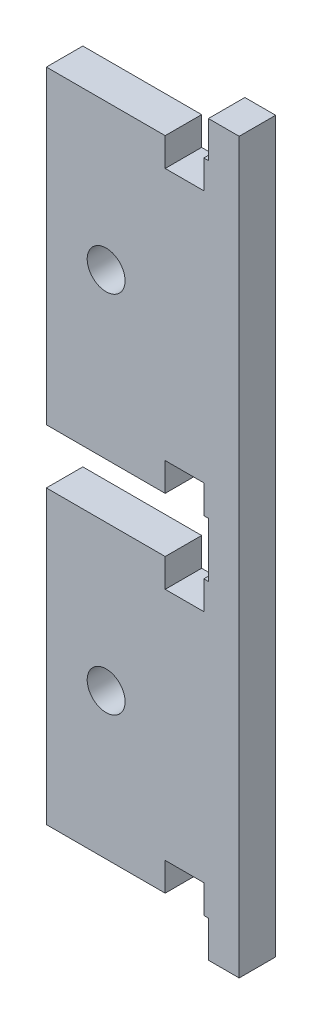
ISO-10303-21;
HEADER;
FILE_DESCRIPTION(('STEP AP214'),'2;1');
FILE_NAME('part.step','',(''),(''),'','','');
FILE_SCHEMA(('AUTOMOTIVE_DESIGN { 1 0 10303 214 1 1 1 1 }'));
ENDSEC;
DATA;
#1=APPLICATION_CONTEXT('core data for automotive mechanical design processes');
#2=APPLICATION_PROTOCOL_DEFINITION('international standard','automotive_design',2000,#1);
#3=PRODUCT_CONTEXT('',#1,'mechanical');
#4=PRODUCT('Part','Part','',(#3));
#5=PRODUCT_RELATED_PRODUCT_CATEGORY('part','',(#4));
#6=PRODUCT_DEFINITION_FORMATION('','',#4);
#7=PRODUCT_DEFINITION_CONTEXT('part definition',#1,'design');
#8=PRODUCT_DEFINITION('design','',#6,#7);
#9=PRODUCT_DEFINITION_SHAPE('','',#8);
#10=(LENGTH_UNIT() NAMED_UNIT(*) SI_UNIT(.MILLI.,.METRE.));
#11=(NAMED_UNIT(*) PLANE_ANGLE_UNIT() SI_UNIT($,.RADIAN.));
#12=(NAMED_UNIT(*) SI_UNIT($,.STERADIAN.) SOLID_ANGLE_UNIT());
#13=UNCERTAINTY_MEASURE_WITH_UNIT(LENGTH_MEASURE(1.E-05),#10,'distance_accuracy_value','');
#14=(GEOMETRIC_REPRESENTATION_CONTEXT(3) GLOBAL_UNCERTAINTY_ASSIGNED_CONTEXT((#13)) GLOBAL_UNIT_ASSIGNED_CONTEXT((#10,
#11,#12)) REPRESENTATION_CONTEXT('',''));
#15=CARTESIAN_POINT('',(0.,0.,0.));
#16=DIRECTION('',(0.,0.,1.));
#17=DIRECTION('',(1.,0.,0.));
#18=AXIS2_PLACEMENT_3D('',#15,#16,#17);
#19=CARTESIAN_POINT('',(0.,0.,6.35));
#20=DIRECTION('',(0.,0.,-1.));
#21=DIRECTION('',(-1.,0.,0.));
#22=AXIS2_PLACEMENT_3D('',#19,#20,#21);
#23=PLANE('',#22);
#24=CARTESIAN_POINT('',(17.4625000000002,95.2500000000022,6.35));
#25=DIRECTION('',(0.,0.,1.));
#26=DIRECTION('',(1.,0.,0.));
#27=AXIS2_PLACEMENT_3D('',#24,#25,#26);
#28=CIRCLE('',#27,3.29999999999999);
#29=CARTESIAN_POINT('',(20.7625000000001,95.2500000000022,6.35));
#30=VERTEX_POINT('',#29);
#31=EDGE_CURVE('E397',#30,#30,#28,.T.);
#32=ORIENTED_EDGE('',*,*,#31,.F.);
#33=EDGE_LOOP('',(#32));
#34=FACE_BOUND('',#33,.T.);
#35=CARTESIAN_POINT('',(17.4625000000025,31.7500000000057,6.35));
#36=DIRECTION('',(0.,0.,1.));
#37=DIRECTION('',(1.,0.,0.));
#38=AXIS2_PLACEMENT_3D('',#35,#36,#37);
#39=CIRCLE('',#38,3.29999999999999);
#40=CARTESIAN_POINT('',(20.7625000000025,31.7500000000057,6.35));
#41=VERTEX_POINT('',#40);
#42=EDGE_CURVE('E391',#41,#41,#39,.T.);
#43=ORIENTED_EDGE('',*,*,#42,.F.);
#44=EDGE_LOOP('',(#43));
#45=FACE_BOUND('',#44,.T.);
#46=DIRECTION('',(-1.,0.,0.));
#47=VECTOR('',#46,1.);
#48=CARTESIAN_POINT('',(0.,6.34999999999999,6.35));
#49=LINE('',#48,#47);
#50=CARTESIAN_POINT('',(27.7495000000019,6.34999999999999,6.35));
#51=VERTEX_POINT('',#50);
#52=CARTESIAN_POINT('',(7.05050000000018,6.34999999999999,6.35));
#53=VERTEX_POINT('',#52);
#54=EDGE_CURVE('E375',#51,#53,#49,.T.);
#55=ORIENTED_EDGE('',*,*,#54,.F.);
#56=DIRECTION('',(0.,-1.,0.));
#57=VECTOR('',#56,1.);
#58=CARTESIAN_POINT('',(27.7495000000019,0.,6.35));
#59=LINE('',#58,#57);
#60=CARTESIAN_POINT('',(27.7495000000019,11.303,6.35));
#61=VERTEX_POINT('',#60);
#62=EDGE_CURVE('E243',#61,#51,#59,.T.);
#63=ORIENTED_EDGE('',*,*,#62,.F.);
#64=DIRECTION('',(-1.,0.,0.));
#65=VECTOR('',#64,1.);
#66=CARTESIAN_POINT('',(0.,11.303,6.35));
#67=LINE('',#66,#65);
#68=CARTESIAN_POINT('',(34.4805000000019,11.303,6.35));
#69=VERTEX_POINT('',#68);
#70=EDGE_CURVE('E245',#69,#61,#67,.T.);
#71=ORIENTED_EDGE('',*,*,#70,.F.);
#72=DIRECTION('',(0.,-1.,0.));
#73=VECTOR('',#72,1.);
#74=CARTESIAN_POINT('',(34.4805000000019,0.,6.35));
#75=LINE('',#74,#73);
#76=CARTESIAN_POINT('',(34.4805000000019,6.34999999999999,6.35));
#77=VERTEX_POINT('',#76);
#78=EDGE_CURVE('E223',#69,#77,#75,.T.);
#79=ORIENTED_EDGE('',*,*,#78,.T.);
#80=CARTESIAN_POINT('',(35.2818700000001,6.34999999999999,6.35));
#81=VERTEX_POINT('',#80);
#82=EDGE_CURVE('E370',#81,#77,#49,.T.);
#83=ORIENTED_EDGE('',*,*,#82,.F.);
#84=DIRECTION('',(0.,-1.,0.));
#85=VECTOR('',#84,1.);
#86=CARTESIAN_POINT('',(35.2818700000002,0.,6.35));
#87=LINE('',#86,#85);
#88=CARTESIAN_POINT('',(35.2818700000002,0.,6.35));
#89=VERTEX_POINT('',#88);
#90=EDGE_CURVE('E252',#81,#89,#87,.T.);
#91=ORIENTED_EDGE('',*,*,#90,.T.);
#92=DIRECTION('',(1.,0.,0.));
#93=VECTOR('',#92,1.);
#94=CARTESIAN_POINT('',(0.,0.,6.35));
#95=LINE('',#94,#93);
#96=CARTESIAN_POINT('',(40.64,0.,6.35));
#97=VERTEX_POINT('',#96);
#98=EDGE_CURVE('E404',#89,#97,#95,.T.);
#99=ORIENTED_EDGE('',*,*,#98,.T.);
#100=DIRECTION('',(0.,1.,0.));
#101=VECTOR('',#100,1.);
#102=CARTESIAN_POINT('',(40.64,0.,6.35));
#103=LINE('',#102,#101);
#104=CARTESIAN_POINT('',(40.64,127.,6.35));
#105=VERTEX_POINT('',#104);
#106=EDGE_CURVE('E406',#97,#105,#103,.T.);
#107=ORIENTED_EDGE('',*,*,#106,.T.);
#108=DIRECTION('',(-1.,0.,0.));
#109=VECTOR('',#108,1.);
#110=CARTESIAN_POINT('',(0.,127.,6.35));
#111=LINE('',#110,#109);
#112=CARTESIAN_POINT('',(35.2818700000001,127.,6.35));
#113=VERTEX_POINT('',#112);
#114=EDGE_CURVE('E409',#105,#113,#111,.T.);
#115=ORIENTED_EDGE('',*,*,#114,.T.);
#116=DIRECTION('',(0.,-1.,0.));
#117=VECTOR('',#116,1.);
#118=CARTESIAN_POINT('',(35.2818700000002,0.,6.35));
#119=LINE('',#118,#117);
#120=CARTESIAN_POINT('',(35.2818700000001,120.65,6.35));
#121=VERTEX_POINT('',#120);
#122=EDGE_CURVE('E323',#113,#121,#119,.T.);
#123=ORIENTED_EDGE('',*,*,#122,.T.);
#124=DIRECTION('',(1.,0.,0.));
#125=VECTOR('',#124,1.);
#126=CARTESIAN_POINT('',(0.,120.65,6.35));
#127=LINE('',#126,#125);
#128=CARTESIAN_POINT('',(34.4805000000019,120.65,6.35));
#129=VERTEX_POINT('',#128);
#130=EDGE_CURVE('E324',#129,#121,#127,.T.);
#131=ORIENTED_EDGE('',*,*,#130,.F.);
#132=DIRECTION('',(0.,-1.,0.));
#133=VECTOR('',#132,1.);
#134=CARTESIAN_POINT('',(34.4805000000019,0.,6.35));
#135=LINE('',#134,#133);
#136=CARTESIAN_POINT('',(34.4805000000019,115.697000000002,6.35));
#137=VERTEX_POINT('',#136);
#138=EDGE_CURVE('E297',#129,#137,#135,.T.);
#139=ORIENTED_EDGE('',*,*,#138,.T.);
#140=DIRECTION('',(-1.,0.,0.));
#141=VECTOR('',#140,1.);
#142=CARTESIAN_POINT('',(0.,115.697000000002,6.35));
#143=LINE('',#142,#141);
#144=CARTESIAN_POINT('',(27.7495000000019,115.697000000002,6.35));
#145=VERTEX_POINT('',#144);
#146=EDGE_CURVE('E304',#137,#145,#143,.T.);
#147=ORIENTED_EDGE('',*,*,#146,.T.);
#148=DIRECTION('',(0.,-1.,0.));
#149=VECTOR('',#148,1.);
#150=CARTESIAN_POINT('',(27.7495000000019,0.,6.35));
#151=LINE('',#150,#149);
#152=CARTESIAN_POINT('',(27.7495000000019,120.65,6.35));
#153=VERTEX_POINT('',#152);
#154=EDGE_CURVE('E302',#153,#145,#151,.T.);
#155=ORIENTED_EDGE('',*,*,#154,.F.);
#156=CARTESIAN_POINT('',(7.05050000000017,120.65,6.35));
#157=VERTEX_POINT('',#156);
#158=EDGE_CURVE('E320',#157,#153,#127,.T.);
#159=ORIENTED_EDGE('',*,*,#158,.F.);
#160=DIRECTION('',(0.,1.,0.));
#161=VECTOR('',#160,1.);
#162=CARTESIAN_POINT('',(7.05050000000018,0.,6.35));
#163=LINE('',#162,#161);
#164=CARTESIAN_POINT('',(7.05050000000017,66.6750000000037,6.35));
#165=VERTEX_POINT('',#164);
#166=EDGE_CURVE('E387',#165,#157,#163,.T.);
#167=ORIENTED_EDGE('',*,*,#166,.F.);
#168=DIRECTION('',(-1.,0.,0.));
#169=VECTOR('',#168,1.);
#170=CARTESIAN_POINT('',(0.,66.6750000000037,6.35));
#171=LINE('',#170,#169);
#172=CARTESIAN_POINT('',(27.7495000000019,66.6750000000037,6.35));
#173=VERTEX_POINT('',#172);
#174=EDGE_CURVE('E354',#173,#165,#171,.T.);
#175=ORIENTED_EDGE('',*,*,#174,.F.);
#176=DIRECTION('',(0.,-1.,0.));
#177=VECTOR('',#176,1.);
#178=CARTESIAN_POINT('',(27.7495000000019,0.,6.35));
#179=LINE('',#178,#177);
#180=CARTESIAN_POINT('',(27.7495000000019,71.6280000000059,6.35));
#181=VERTEX_POINT('',#180);
#182=EDGE_CURVE('E59',#181,#173,#179,.T.);
#183=ORIENTED_EDGE('',*,*,#182,.F.);
#184=DIRECTION('',(-1.,0.,0.));
#185=VECTOR('',#184,1.);
#186=CARTESIAN_POINT('',(0.,71.6280000000059,6.35));
#187=LINE('',#186,#185);
#188=CARTESIAN_POINT('',(34.4805000000019,71.6280000000059,6.35));
#189=VERTEX_POINT('',#188);
#190=EDGE_CURVE('E286',#189,#181,#187,.T.);
#191=ORIENTED_EDGE('',*,*,#190,.F.);
#192=DIRECTION('',(0.,-1.,0.));
#193=VECTOR('',#192,1.);
#194=CARTESIAN_POINT('',(34.4805000000019,0.,6.35));
#195=LINE('',#194,#193);
#196=CARTESIAN_POINT('',(34.4805000000019,66.6750000000037,6.35));
#197=VERTEX_POINT('',#196);
#198=EDGE_CURVE('E283',#189,#197,#195,.T.);
#199=ORIENTED_EDGE('',*,*,#198,.T.);
#200=CARTESIAN_POINT('',(35.2818700000001,66.6750000000037,6.35));
#201=VERTEX_POINT('',#200);
#202=EDGE_CURVE('E355',#201,#197,#171,.T.);
#203=ORIENTED_EDGE('',*,*,#202,.F.);
#204=DIRECTION('',(0.,-1.,0.));
#205=VECTOR('',#204,1.);
#206=CARTESIAN_POINT('',(35.2818700000002,0.,6.35));
#207=LINE('',#206,#205);
#208=CARTESIAN_POINT('',(35.2818700000001,57.1500000000035,6.35));
#209=VERTEX_POINT('',#208);
#210=EDGE_CURVE('E350',#201,#209,#207,.T.);
#211=ORIENTED_EDGE('',*,*,#210,.T.);
#212=DIRECTION('',(1.,0.,0.));
#213=VECTOR('',#212,1.);
#214=CARTESIAN_POINT('',(0.,57.1500000000035,6.35));
#215=LINE('',#214,#213);
#216=CARTESIAN_POINT('',(34.4805000000019,57.1500000000035,6.35));
#217=VERTEX_POINT('',#216);
#218=EDGE_CURVE('E351',#217,#209,#215,.T.);
#219=ORIENTED_EDGE('',*,*,#218,.F.);
#220=DIRECTION('',(0.,-1.,0.));
#221=VECTOR('',#220,1.);
#222=CARTESIAN_POINT('',(34.4805000000019,0.,6.35));
#223=LINE('',#222,#221);
#224=CARTESIAN_POINT('',(34.4805000000019,52.1970000000057,6.35));
#225=VERTEX_POINT('',#224);
#226=EDGE_CURVE('E258',#217,#225,#223,.T.);
#227=ORIENTED_EDGE('',*,*,#226,.T.);
#228=DIRECTION('',(-1.,0.,0.));
#229=VECTOR('',#228,1.);
#230=CARTESIAN_POINT('',(0.,52.1970000000057,6.35));
#231=LINE('',#230,#229);
#232=CARTESIAN_POINT('',(27.7495000000019,52.1970000000057,6.35));
#233=VERTEX_POINT('',#232);
#234=EDGE_CURVE('E265',#225,#233,#231,.T.);
#235=ORIENTED_EDGE('',*,*,#234,.T.);
#236=DIRECTION('',(0.,-1.,0.));
#237=VECTOR('',#236,1.);
#238=CARTESIAN_POINT('',(27.7495000000019,0.,6.35));
#239=LINE('',#238,#237);
#240=CARTESIAN_POINT('',(27.7495000000019,57.1500000000035,6.35));
#241=VERTEX_POINT('',#240);
#242=EDGE_CURVE('E263',#241,#233,#239,.T.);
#243=ORIENTED_EDGE('',*,*,#242,.F.);
#244=CARTESIAN_POINT('',(7.05050000000018,57.1500000000035,6.35));
#245=VERTEX_POINT('',#244);
#246=EDGE_CURVE('E347',#245,#241,#215,.T.);
#247=ORIENTED_EDGE('',*,*,#246,.F.);
#248=EDGE_CURVE('E390',#53,#245,#163,.T.);
#249=ORIENTED_EDGE('',*,*,#248,.F.);
#250=EDGE_LOOP('',(#55,#63,#71,#79,#83,#91,#99,#107,#115,#123,#131,#139,#147,#155,#159,#167,
#175,#183,#191,#199,#203,#211,#219,#227,#235,#243,#247,#249));
#251=FACE_BOUND('',#250,.T.);
#252=ADVANCED_FACE('F36',(#34,#45,#251),#23,.F.);
#253=CARTESIAN_POINT('',(0.,0.,0.));
#254=DIRECTION('',(0.,0.,-1.));
#255=DIRECTION('',(-1.,0.,0.));
#256=AXIS2_PLACEMENT_3D('',#253,#254,#255);
#257=PLANE('',#256);
#258=DIRECTION('',(0.,-1.,0.));
#259=VECTOR('',#258,1.);
#260=CARTESIAN_POINT('',(27.7495000000019,0.,0.));
#261=LINE('',#260,#259);
#262=CARTESIAN_POINT('',(27.7495000000019,11.303,0.));
#263=VERTEX_POINT('',#262);
#264=CARTESIAN_POINT('',(27.7495000000019,6.34999999999999,0.));
#265=VERTEX_POINT('',#264);
#266=EDGE_CURVE('E228',#263,#265,#261,.T.);
#267=ORIENTED_EDGE('',*,*,#266,.T.);
#268=DIRECTION('',(-1.,0.,0.));
#269=VECTOR('',#268,1.);
#270=CARTESIAN_POINT('',(0.,6.34999999999999,0.));
#271=LINE('',#270,#269);
#272=CARTESIAN_POINT('',(7.05050000000018,6.34999999999999,0.));
#273=VERTEX_POINT('',#272);
#274=EDGE_CURVE('E369',#265,#273,#271,.T.);
#275=ORIENTED_EDGE('',*,*,#274,.T.);
#276=DIRECTION('',(0.,-1.,0.));
#277=VECTOR('',#276,1.);
#278=CARTESIAN_POINT('',(7.05050000000018,0.,0.));
#279=LINE('',#278,#277);
#280=CARTESIAN_POINT('',(7.05050000000018,57.1500000000035,0.));
#281=VERTEX_POINT('',#280);
#282=EDGE_CURVE('E330',#281,#273,#279,.T.);
#283=ORIENTED_EDGE('',*,*,#282,.F.);
#284=DIRECTION('',(1.,0.,0.));
#285=VECTOR('',#284,1.);
#286=CARTESIAN_POINT('',(0.,57.1500000000035,0.));
#287=LINE('',#286,#285);
#288=CARTESIAN_POINT('',(27.7495000000019,57.1500000000035,0.));
#289=VERTEX_POINT('',#288);
#290=EDGE_CURVE('E335',#281,#289,#287,.T.);
#291=ORIENTED_EDGE('',*,*,#290,.T.);
#292=DIRECTION('',(0.,-1.,0.));
#293=VECTOR('',#292,1.);
#294=CARTESIAN_POINT('',(27.7495000000019,0.,0.));
#295=LINE('',#294,#293);
#296=CARTESIAN_POINT('',(27.7495000000019,52.1970000000057,0.));
#297=VERTEX_POINT('',#296);
#298=EDGE_CURVE('E254',#289,#297,#295,.T.);
#299=ORIENTED_EDGE('',*,*,#298,.T.);
#300=DIRECTION('',(-1.,0.,0.));
#301=VECTOR('',#300,1.);
#302=CARTESIAN_POINT('',(0.,52.1970000000057,0.));
#303=LINE('',#302,#301);
#304=CARTESIAN_POINT('',(34.4805000000019,52.1970000000057,0.));
#305=VERTEX_POINT('',#304);
#306=EDGE_CURVE('E257',#305,#297,#303,.T.);
#307=ORIENTED_EDGE('',*,*,#306,.F.);
#308=DIRECTION('',(0.,-1.,0.));
#309=VECTOR('',#308,1.);
#310=CARTESIAN_POINT('',(34.4805000000019,0.,0.));
#311=LINE('',#310,#309);
#312=CARTESIAN_POINT('',(34.4805000000019,57.1500000000035,0.));
#313=VERTEX_POINT('',#312);
#314=EDGE_CURVE('E260',#313,#305,#311,.T.);
#315=ORIENTED_EDGE('',*,*,#314,.F.);
#316=CARTESIAN_POINT('',(35.2818700000001,57.1500000000035,0.));
#317=VERTEX_POINT('',#316);
#318=EDGE_CURVE('E339',#313,#317,#287,.T.);
#319=ORIENTED_EDGE('',*,*,#318,.T.);
#320=DIRECTION('',(0.,-1.,0.));
#321=VECTOR('',#320,1.);
#322=CARTESIAN_POINT('',(35.2818700000002,0.,0.));
#323=LINE('',#322,#321);
#324=CARTESIAN_POINT('',(35.2818700000001,66.6750000000037,0.));
#325=VERTEX_POINT('',#324);
#326=EDGE_CURVE('E338',#325,#317,#323,.T.);
#327=ORIENTED_EDGE('',*,*,#326,.F.);
#328=DIRECTION('',(-1.,0.,0.));
#329=VECTOR('',#328,1.);
#330=CARTESIAN_POINT('',(0.,66.6750000000037,0.));
#331=LINE('',#330,#329);
#332=CARTESIAN_POINT('',(34.4805000000019,66.6750000000037,0.));
#333=VERTEX_POINT('',#332);
#334=EDGE_CURVE('E343',#325,#333,#331,.T.);
#335=ORIENTED_EDGE('',*,*,#334,.T.);
#336=DIRECTION('',(0.,-1.,0.));
#337=VECTOR('',#336,1.);
#338=CARTESIAN_POINT('',(34.4805000000019,0.,0.));
#339=LINE('',#338,#337);
#340=CARTESIAN_POINT('',(34.4805000000019,71.6280000000059,0.));
#341=VERTEX_POINT('',#340);
#342=EDGE_CURVE('E274',#341,#333,#339,.T.);
#343=ORIENTED_EDGE('',*,*,#342,.F.);
#344=DIRECTION('',(-1.,0.,0.));
#345=VECTOR('',#344,1.);
#346=CARTESIAN_POINT('',(0.,71.6280000000059,0.));
#347=LINE('',#346,#345);
#348=CARTESIAN_POINT('',(27.7495000000019,71.6280000000059,0.));
#349=VERTEX_POINT('',#348);
#350=EDGE_CURVE('E276',#341,#349,#347,.T.);
#351=ORIENTED_EDGE('',*,*,#350,.T.);
#352=DIRECTION('',(0.,-1.,0.));
#353=VECTOR('',#352,1.);
#354=CARTESIAN_POINT('',(27.7495000000019,0.,0.));
#355=LINE('',#354,#353);
#356=CARTESIAN_POINT('',(27.7495000000019,66.6750000000037,0.));
#357=VERTEX_POINT('',#356);
#358=EDGE_CURVE('E279',#349,#357,#355,.T.);
#359=ORIENTED_EDGE('',*,*,#358,.T.);
#360=CARTESIAN_POINT('',(7.05050000000017,66.6750000000037,0.));
#361=VERTEX_POINT('',#360);
#362=EDGE_CURVE('E342',#357,#361,#331,.T.);
#363=ORIENTED_EDGE('',*,*,#362,.T.);
#364=CARTESIAN_POINT('',(7.05050000000017,120.65,0.));
#365=VERTEX_POINT('',#364);
#366=EDGE_CURVE('E386',#365,#361,#279,.T.);
#367=ORIENTED_EDGE('',*,*,#366,.F.);
#368=DIRECTION('',(1.,0.,0.));
#369=VECTOR('',#368,1.);
#370=CARTESIAN_POINT('',(0.,120.65,0.));
#371=LINE('',#370,#369);
#372=CARTESIAN_POINT('',(27.7495000000019,120.65,0.));
#373=VERTEX_POINT('',#372);
#374=EDGE_CURVE('E312',#365,#373,#371,.T.);
#375=ORIENTED_EDGE('',*,*,#374,.T.);
#376=DIRECTION('',(0.,-1.,0.));
#377=VECTOR('',#376,1.);
#378=CARTESIAN_POINT('',(27.7495000000019,0.,0.));
#379=LINE('',#378,#377);
#380=CARTESIAN_POINT('',(27.7495000000019,115.697000000002,0.));
#381=VERTEX_POINT('',#380);
#382=EDGE_CURVE('E293',#373,#381,#379,.T.);
#383=ORIENTED_EDGE('',*,*,#382,.T.);
#384=DIRECTION('',(-1.,0.,0.));
#385=VECTOR('',#384,1.);
#386=CARTESIAN_POINT('',(0.,115.697000000002,0.));
#387=LINE('',#386,#385);
#388=CARTESIAN_POINT('',(34.4805000000019,115.697000000002,0.));
#389=VERTEX_POINT('',#388);
#390=EDGE_CURVE('E296',#389,#381,#387,.T.);
#391=ORIENTED_EDGE('',*,*,#390,.F.);
#392=DIRECTION('',(0.,-1.,0.));
#393=VECTOR('',#392,1.);
#394=CARTESIAN_POINT('',(34.4805000000019,0.,0.));
#395=LINE('',#394,#393);
#396=CARTESIAN_POINT('',(34.4805000000019,120.65,0.));
#397=VERTEX_POINT('',#396);
#398=EDGE_CURVE('E299',#397,#389,#395,.T.);
#399=ORIENTED_EDGE('',*,*,#398,.F.);
#400=CARTESIAN_POINT('',(35.2818700000001,120.65,0.));
#401=VERTEX_POINT('',#400);
#402=EDGE_CURVE('E316',#397,#401,#371,.T.);
#403=ORIENTED_EDGE('',*,*,#402,.T.);
#404=DIRECTION('',(0.,-1.,0.));
#405=VECTOR('',#404,1.);
#406=CARTESIAN_POINT('',(35.2818700000002,0.,0.));
#407=LINE('',#406,#405);
#408=CARTESIAN_POINT('',(35.2818700000001,127.,0.));
#409=VERTEX_POINT('',#408);
#410=EDGE_CURVE('E315',#409,#401,#407,.T.);
#411=ORIENTED_EDGE('',*,*,#410,.F.);
#412=DIRECTION('',(-1.,0.,0.));
#413=VECTOR('',#412,1.);
#414=CARTESIAN_POINT('',(0.,127.,0.));
#415=LINE('',#414,#413);
#416=CARTESIAN_POINT('',(40.64,127.,0.));
#417=VERTEX_POINT('',#416);
#418=EDGE_CURVE('E407',#417,#409,#415,.T.);
#419=ORIENTED_EDGE('',*,*,#418,.F.);
#420=DIRECTION('',(0.,1.,0.));
#421=VECTOR('',#420,1.);
#422=CARTESIAN_POINT('',(40.64,0.,0.));
#423=LINE('',#422,#421);
#424=CARTESIAN_POINT('',(40.64,0.,0.));
#425=VERTEX_POINT('',#424);
#426=EDGE_CURVE('E414',#425,#417,#423,.T.);
#427=ORIENTED_EDGE('',*,*,#426,.F.);
#428=DIRECTION('',(1.,0.,0.));
#429=VECTOR('',#428,1.);
#430=CARTESIAN_POINT('',(0.,0.,0.));
#431=LINE('',#430,#429);
#432=CARTESIAN_POINT('',(35.2818700000002,0.,0.));
#433=VERTEX_POINT('',#432);
#434=EDGE_CURVE('E403',#433,#425,#431,.T.);
#435=ORIENTED_EDGE('',*,*,#434,.F.);
#436=DIRECTION('',(0.,-1.,0.));
#437=VECTOR('',#436,1.);
#438=CARTESIAN_POINT('',(35.2818700000002,0.,0.));
#439=LINE('',#438,#437);
#440=CARTESIAN_POINT('',(35.2818700000001,6.34999999999999,0.));
#441=VERTEX_POINT('',#440);
#442=EDGE_CURVE('E367',#441,#433,#439,.T.);
#443=ORIENTED_EDGE('',*,*,#442,.F.);
#444=CARTESIAN_POINT('',(34.4805000000019,6.34999999999999,0.));
#445=VERTEX_POINT('',#444);
#446=EDGE_CURVE('E242',#441,#445,#271,.T.);
#447=ORIENTED_EDGE('',*,*,#446,.T.);
#448=DIRECTION('',(0.,-1.,0.));
#449=VECTOR('',#448,1.);
#450=CARTESIAN_POINT('',(34.4805000000019,0.,0.));
#451=LINE('',#450,#449);
#452=CARTESIAN_POINT('',(34.4805000000019,11.303,0.));
#453=VERTEX_POINT('',#452);
#454=EDGE_CURVE('E51',#453,#445,#451,.T.);
#455=ORIENTED_EDGE('',*,*,#454,.F.);
#456=DIRECTION('',(-1.,0.,0.));
#457=VECTOR('',#456,1.);
#458=CARTESIAN_POINT('',(0.,11.303,0.));
#459=LINE('',#458,#457);
#460=EDGE_CURVE('E231',#453,#263,#459,.T.);
#461=ORIENTED_EDGE('',*,*,#460,.T.);
#462=EDGE_LOOP('',(#267,#275,#283,#291,#299,#307,#315,#319,#327,#335,#343,#351,#359,#363,#367,
#375,#383,#391,#399,#403,#411,#419,#427,#435,#443,#447,#455,#461));
#463=FACE_BOUND('',#462,.T.);
#464=CARTESIAN_POINT('',(17.4625000000025,31.7500000000057,0.));
#465=DIRECTION('',(0.,0.,1.));
#466=DIRECTION('',(1.,0.,0.));
#467=AXIS2_PLACEMENT_3D('',#464,#465,#466);
#468=CIRCLE('',#467,3.3);
#469=CARTESIAN_POINT('',(20.7625000000025,31.7500000000057,0.));
#470=VERTEX_POINT('',#469);
#471=EDGE_CURVE('E394',#470,#470,#468,.T.);
#472=ORIENTED_EDGE('',*,*,#471,.T.);
#473=EDGE_LOOP('',(#472));
#474=FACE_BOUND('',#473,.T.);
#475=CARTESIAN_POINT('',(17.4625000000002,95.2500000000022,0.));
#476=DIRECTION('',(0.,0.,1.));
#477=DIRECTION('',(1.,0.,0.));
#478=AXIS2_PLACEMENT_3D('',#475,#476,#477);
#479=CIRCLE('',#478,3.3);
#480=CARTESIAN_POINT('',(20.7625000000002,95.2500000000022,0.));
#481=VERTEX_POINT('',#480);
#482=EDGE_CURVE('E400',#481,#481,#479,.T.);
#483=ORIENTED_EDGE('',*,*,#482,.T.);
#484=EDGE_LOOP('',(#483));
#485=FACE_BOUND('',#484,.T.);
#486=ADVANCED_FACE('F238',(#463,#474,#485),#257,.T.);
#487=CARTESIAN_POINT('',(0.,6.34999999999999,0.));
#488=DIRECTION('',(0.,1.,0.));
#489=DIRECTION('',(-1.,0.,0.));
#490=AXIS2_PLACEMENT_3D('',#487,#488,#489);
#491=PLANE('',#490);
#492=DIRECTION('',(0.,0.,1.));
#493=VECTOR('',#492,1.);
#494=CARTESIAN_POINT('',(34.4805000000019,6.34999999999999,0.));
#495=LINE('',#494,#493);
#496=EDGE_CURVE('E44',#445,#77,#495,.T.);
#497=ORIENTED_EDGE('',*,*,#496,.F.);
#498=ORIENTED_EDGE('',*,*,#446,.F.);
#499=DIRECTION('',(0.,0.,1.));
#500=VECTOR('',#499,1.);
#501=CARTESIAN_POINT('',(35.2818700000001,6.34999999999999,0.));
#502=LINE('',#501,#500);
#503=EDGE_CURVE('E381',#441,#81,#502,.T.);
#504=ORIENTED_EDGE('',*,*,#503,.T.);
#505=ORIENTED_EDGE('',*,*,#82,.T.);
#506=EDGE_LOOP('',(#497,#498,#504,#505));
#507=FACE_BOUND('',#506,.T.);
#508=ADVANCED_FACE('F441',(#507),#491,.F.);
#509=CARTESIAN_POINT('',(0.,66.6750000000037,0.));
#510=DIRECTION('',(0.,1.,0.));
#511=DIRECTION('',(0.,0.,1.));
#512=AXIS2_PLACEMENT_3D('',#509,#510,#511);
#513=PLANE('',#512);
#514=DIRECTION('',(0.,0.,1.));
#515=VECTOR('',#514,1.);
#516=CARTESIAN_POINT('',(34.4805000000019,66.6750000000037,0.));
#517=LINE('',#516,#515);
#518=EDGE_CURVE('E435',#333,#197,#517,.T.);
#519=ORIENTED_EDGE('',*,*,#518,.F.);
#520=ORIENTED_EDGE('',*,*,#334,.F.);
#521=DIRECTION('',(0.,0.,1.));
#522=VECTOR('',#521,1.);
#523=CARTESIAN_POINT('',(35.2818700000001,66.6750000000037,0.));
#524=LINE('',#523,#522);
#525=EDGE_CURVE('E361',#325,#201,#524,.T.);
#526=ORIENTED_EDGE('',*,*,#525,.T.);
#527=ORIENTED_EDGE('',*,*,#202,.T.);
#528=EDGE_LOOP('',(#519,#520,#526,#527));
#529=FACE_BOUND('',#528,.T.);
#530=ADVANCED_FACE('F506',(#529),#513,.F.);
#531=CARTESIAN_POINT('',(0.,57.1500000000035,0.));
#532=DIRECTION('',(0.,-1.,0.));
#533=DIRECTION('',(0.,0.,-1.));
#534=AXIS2_PLACEMENT_3D('',#531,#532,#533);
#535=PLANE('',#534);
#536=DIRECTION('',(0.,0.,-1.));
#537=VECTOR('',#536,1.);
#538=CARTESIAN_POINT('',(34.4805000000019,57.1500000000035,0.));
#539=LINE('',#538,#537);
#540=EDGE_CURVE('E431',#217,#313,#539,.T.);
#541=ORIENTED_EDGE('',*,*,#540,.F.);
#542=ORIENTED_EDGE('',*,*,#218,.T.);
#543=DIRECTION('',(0.,0.,1.));
#544=VECTOR('',#543,1.);
#545=CARTESIAN_POINT('',(35.2818700000001,57.1500000000035,0.));
#546=LINE('',#545,#544);
#547=EDGE_CURVE('E363',#317,#209,#546,.T.);
#548=ORIENTED_EDGE('',*,*,#547,.F.);
#549=ORIENTED_EDGE('',*,*,#318,.F.);
#550=EDGE_LOOP('',(#541,#542,#548,#549));
#551=FACE_BOUND('',#550,.T.);
#552=ADVANCED_FACE('F516',(#551),#535,.F.);
#553=CARTESIAN_POINT('',(0.,120.65,0.));
#554=DIRECTION('',(0.,-1.,0.));
#555=DIRECTION('',(0.,0.,-1.));
#556=AXIS2_PLACEMENT_3D('',#553,#554,#555);
#557=PLANE('',#556);
#558=DIRECTION('',(0.,0.,-1.));
#559=VECTOR('',#558,1.);
#560=CARTESIAN_POINT('',(34.4805000000019,120.65,0.));
#561=LINE('',#560,#559);
#562=EDGE_CURVE('E426',#129,#397,#561,.T.);
#563=ORIENTED_EDGE('',*,*,#562,.F.);
#564=ORIENTED_EDGE('',*,*,#130,.T.);
#565=DIRECTION('',(0.,0.,1.));
#566=VECTOR('',#565,1.);
#567=CARTESIAN_POINT('',(35.2818700000001,120.65,0.));
#568=LINE('',#567,#566);
#569=EDGE_CURVE('E331',#401,#121,#568,.T.);
#570=ORIENTED_EDGE('',*,*,#569,.F.);
#571=ORIENTED_EDGE('',*,*,#402,.F.);
#572=EDGE_LOOP('',(#563,#564,#570,#571));
#573=FACE_BOUND('',#572,.T.);
#574=ADVANCED_FACE('F469',(#573),#557,.F.);
#575=CARTESIAN_POINT('',(0.,0.,6.35));
#576=DIRECTION('',(0.,1.,0.));
#577=DIRECTION('',(0.,0.,1.));
#578=AXIS2_PLACEMENT_3D('',#575,#576,#577);
#579=PLANE('',#578);
#580=DIRECTION('',(0.,0.,1.));
#581=VECTOR('',#580,1.);
#582=CARTESIAN_POINT('',(35.2818700000002,0.,0.));
#583=LINE('',#582,#581);
#584=EDGE_CURVE('E372',#433,#89,#583,.T.);
#585=ORIENTED_EDGE('',*,*,#584,.F.);
#586=ORIENTED_EDGE('',*,*,#434,.T.);
#587=DIRECTION('',(0.,0.,-1.));
#588=VECTOR('',#587,1.);
#589=CARTESIAN_POINT('',(40.64,0.,6.35));
#590=LINE('',#589,#588);
#591=EDGE_CURVE('E420',#97,#425,#590,.T.);
#592=ORIENTED_EDGE('',*,*,#591,.F.);
#593=ORIENTED_EDGE('',*,*,#98,.F.);
#594=EDGE_LOOP('',(#585,#586,#592,#593));
#595=FACE_BOUND('',#594,.T.);
#596=ADVANCED_FACE('F38',(#595),#579,.F.);
#597=CARTESIAN_POINT('',(0.,127.,6.35));
#598=DIRECTION('',(0.,-1.,0.));
#599=DIRECTION('',(0.,0.,-1.));
#600=AXIS2_PLACEMENT_3D('',#597,#598,#599);
#601=PLANE('',#600);
#602=DIRECTION('',(0.,0.,1.));
#603=VECTOR('',#602,1.);
#604=CARTESIAN_POINT('',(35.2818700000001,127.,0.));
#605=LINE('',#604,#603);
#606=EDGE_CURVE('E327',#409,#113,#605,.T.);
#607=ORIENTED_EDGE('',*,*,#606,.T.);
#608=ORIENTED_EDGE('',*,*,#114,.F.);
#609=DIRECTION('',(0.,0.,-1.));
#610=VECTOR('',#609,1.);
#611=CARTESIAN_POINT('',(40.64,127.,6.35));
#612=LINE('',#611,#610);
#613=EDGE_CURVE('E412',#105,#417,#612,.T.);
#614=ORIENTED_EDGE('',*,*,#613,.T.);
#615=ORIENTED_EDGE('',*,*,#418,.T.);
#616=EDGE_LOOP('',(#607,#608,#614,#615));
#617=FACE_BOUND('',#616,.T.);
#618=ADVANCED_FACE('F458',(#617),#601,.F.);
#619=CARTESIAN_POINT('',(7.05050000000018,0.,0.));
#620=DIRECTION('',(-1.,0.,0.));
#621=DIRECTION('',(0.,-1.,0.));
#622=AXIS2_PLACEMENT_3D('',#619,#620,#621);
#623=PLANE('',#622);
#624=DIRECTION('',(0.,0.,1.));
#625=VECTOR('',#624,1.);
#626=CARTESIAN_POINT('',(7.05050000000017,120.65,0.));
#627=LINE('',#626,#625);
#628=EDGE_CURVE('E319',#365,#157,#627,.T.);
#629=ORIENTED_EDGE('',*,*,#628,.F.);
#630=ORIENTED_EDGE('',*,*,#366,.T.);
#631=DIRECTION('',(0.,0.,1.));
#632=VECTOR('',#631,1.);
#633=CARTESIAN_POINT('',(7.05050000000017,66.6750000000037,0.));
#634=LINE('',#633,#632);
#635=EDGE_CURVE('E358',#361,#165,#634,.T.);
#636=ORIENTED_EDGE('',*,*,#635,.T.);
#637=ORIENTED_EDGE('',*,*,#166,.T.);
#638=EDGE_LOOP('',(#629,#630,#636,#637));
#639=FACE_BOUND('',#638,.T.);
#640=ADVANCED_FACE('F487',(#639),#623,.T.);
#641=CARTESIAN_POINT('',(40.64,0.,6.35));
#642=DIRECTION('',(-1.,0.,0.));
#643=DIRECTION('',(0.,0.,1.));
#644=AXIS2_PLACEMENT_3D('',#641,#642,#643);
#645=PLANE('',#644);
#646=ORIENTED_EDGE('',*,*,#426,.T.);
#647=ORIENTED_EDGE('',*,*,#613,.F.);
#648=ORIENTED_EDGE('',*,*,#106,.F.);
#649=ORIENTED_EDGE('',*,*,#591,.T.);
#650=EDGE_LOOP('',(#646,#647,#648,#649));
#651=FACE_BOUND('',#650,.T.);
#652=ADVANCED_FACE('F454',(#651),#645,.F.);
#653=CARTESIAN_POINT('',(17.4625000000002,95.2500000000022,6.35));
#654=DIRECTION('',(0.,0.,1.));
#655=DIRECTION('',(1.,0.,0.));
#656=AXIS2_PLACEMENT_3D('',#653,#654,#655);
#657=CYLINDRICAL_SURFACE('',#656,3.29999999999999);
#658=ORIENTED_EDGE('',*,*,#482,.F.);
#659=EDGE_LOOP('',(#658));
#660=FACE_BOUND('',#659,.T.);
#661=ORIENTED_EDGE('',*,*,#31,.T.);
#662=EDGE_LOOP('',(#661));
#663=FACE_BOUND('',#662,.T.);
#664=ADVANCED_FACE('F564',(#660,#663),#657,.F.);
#665=CARTESIAN_POINT('',(17.4625000000025,31.7500000000057,6.35));
#666=DIRECTION('',(0.,0.,1.));
#667=DIRECTION('',(1.,0.,0.));
#668=AXIS2_PLACEMENT_3D('',#665,#666,#667);
#669=CYLINDRICAL_SURFACE('',#668,3.29999999999999);
#670=ORIENTED_EDGE('',*,*,#471,.F.);
#671=EDGE_LOOP('',(#670));
#672=FACE_BOUND('',#671,.T.);
#673=ORIENTED_EDGE('',*,*,#42,.T.);
#674=EDGE_LOOP('',(#673));
#675=FACE_BOUND('',#674,.T.);
#676=ADVANCED_FACE('F573',(#672,#675),#669,.F.);
#677=DIRECTION('',(0.,0.,1.));
#678=VECTOR('',#677,1.);
#679=CARTESIAN_POINT('',(7.05050000000018,57.1500000000035,0.));
#680=LINE('',#679,#678);
#681=EDGE_CURVE('E346',#281,#245,#680,.T.);
#682=ORIENTED_EDGE('',*,*,#681,.F.);
#683=ORIENTED_EDGE('',*,*,#282,.T.);
#684=DIRECTION('',(0.,0.,1.));
#685=VECTOR('',#684,1.);
#686=CARTESIAN_POINT('',(7.05050000000018,6.34999999999999,0.));
#687=LINE('',#686,#685);
#688=EDGE_CURVE('E378',#273,#53,#687,.T.);
#689=ORIENTED_EDGE('',*,*,#688,.T.);
#690=ORIENTED_EDGE('',*,*,#248,.T.);
#691=EDGE_LOOP('',(#682,#683,#689,#690));
#692=FACE_BOUND('',#691,.T.);
#693=ADVANCED_FACE('F538',(#692),#623,.T.);
#694=ORIENTED_EDGE('',*,*,#274,.F.);
#695=DIRECTION('',(0.,0.,1.));
#696=VECTOR('',#695,1.);
#697=CARTESIAN_POINT('',(27.7495000000019,6.34999999999999,0.));
#698=LINE('',#697,#696);
#699=EDGE_CURVE('E11',#265,#51,#698,.T.);
#700=ORIENTED_EDGE('',*,*,#699,.T.);
#701=ORIENTED_EDGE('',*,*,#54,.T.);
#702=ORIENTED_EDGE('',*,*,#688,.F.);
#703=EDGE_LOOP('',(#694,#700,#701,#702));
#704=FACE_BOUND('',#703,.T.);
#705=ADVANCED_FACE('F542',(#704),#491,.F.);
#706=CARTESIAN_POINT('',(35.2818700000002,0.,0.));
#707=DIRECTION('',(-1.,0.,0.));
#708=DIRECTION('',(0.,-1.,0.));
#709=AXIS2_PLACEMENT_3D('',#706,#707,#708);
#710=PLANE('',#709);
#711=ORIENTED_EDGE('',*,*,#90,.F.);
#712=ORIENTED_EDGE('',*,*,#503,.F.);
#713=ORIENTED_EDGE('',*,*,#442,.T.);
#714=ORIENTED_EDGE('',*,*,#584,.T.);
#715=EDGE_LOOP('',(#711,#712,#713,#714));
#716=FACE_BOUND('',#715,.T.);
#717=ADVANCED_FACE('F444',(#716),#710,.T.);
#718=ORIENTED_EDGE('',*,*,#362,.F.);
#719=DIRECTION('',(0.,0.,1.));
#720=VECTOR('',#719,1.);
#721=CARTESIAN_POINT('',(27.7495000000019,66.6750000000037,0.));
#722=LINE('',#721,#720);
#723=EDGE_CURVE('E433',#357,#173,#722,.T.);
#724=ORIENTED_EDGE('',*,*,#723,.T.);
#725=ORIENTED_EDGE('',*,*,#174,.T.);
#726=ORIENTED_EDGE('',*,*,#635,.F.);
#727=EDGE_LOOP('',(#718,#724,#725,#726));
#728=FACE_BOUND('',#727,.T.);
#729=ADVANCED_FACE('F494',(#728),#513,.F.);
#730=CARTESIAN_POINT('',(35.2818700000002,0.,0.));
#731=DIRECTION('',(-1.,0.,0.));
#732=DIRECTION('',(0.,-1.,0.));
#733=AXIS2_PLACEMENT_3D('',#730,#731,#732);
#734=PLANE('',#733);
#735=ORIENTED_EDGE('',*,*,#210,.F.);
#736=ORIENTED_EDGE('',*,*,#525,.F.);
#737=ORIENTED_EDGE('',*,*,#326,.T.);
#738=ORIENTED_EDGE('',*,*,#547,.T.);
#739=EDGE_LOOP('',(#735,#736,#737,#738));
#740=FACE_BOUND('',#739,.T.);
#741=ADVANCED_FACE('F511',(#740),#734,.T.);
#742=ORIENTED_EDGE('',*,*,#246,.T.);
#743=DIRECTION('',(0.,0.,-1.));
#744=VECTOR('',#743,1.);
#745=CARTESIAN_POINT('',(27.7495000000019,57.1500000000035,0.));
#746=LINE('',#745,#744);
#747=EDGE_CURVE('E428',#241,#289,#746,.T.);
#748=ORIENTED_EDGE('',*,*,#747,.T.);
#749=ORIENTED_EDGE('',*,*,#290,.F.);
#750=ORIENTED_EDGE('',*,*,#681,.T.);
#751=EDGE_LOOP('',(#742,#748,#749,#750));
#752=FACE_BOUND('',#751,.T.);
#753=ADVANCED_FACE('F534',(#752),#535,.F.);
#754=CARTESIAN_POINT('',(35.2818700000002,0.,0.));
#755=DIRECTION('',(-1.,0.,0.));
#756=DIRECTION('',(0.,-1.,0.));
#757=AXIS2_PLACEMENT_3D('',#754,#755,#756);
#758=PLANE('',#757);
#759=ORIENTED_EDGE('',*,*,#122,.F.);
#760=ORIENTED_EDGE('',*,*,#606,.F.);
#761=ORIENTED_EDGE('',*,*,#410,.T.);
#762=ORIENTED_EDGE('',*,*,#569,.T.);
#763=EDGE_LOOP('',(#759,#760,#761,#762));
#764=FACE_BOUND('',#763,.T.);
#765=ADVANCED_FACE('F462',(#764),#758,.T.);
#766=ORIENTED_EDGE('',*,*,#158,.T.);
#767=DIRECTION('',(0.,0.,-1.));
#768=VECTOR('',#767,1.);
#769=CARTESIAN_POINT('',(27.7495000000019,120.65,0.));
#770=LINE('',#769,#768);
#771=EDGE_CURVE('E423',#153,#373,#770,.T.);
#772=ORIENTED_EDGE('',*,*,#771,.T.);
#773=ORIENTED_EDGE('',*,*,#374,.F.);
#774=ORIENTED_EDGE('',*,*,#628,.T.);
#775=EDGE_LOOP('',(#766,#772,#773,#774));
#776=FACE_BOUND('',#775,.T.);
#777=ADVANCED_FACE('F484',(#776),#557,.F.);
#778=CARTESIAN_POINT('',(34.4805000000019,0.,0.));
#779=DIRECTION('',(-1.,0.,0.));
#780=DIRECTION('',(0.,0.,1.));
#781=AXIS2_PLACEMENT_3D('',#778,#779,#780);
#782=PLANE('',#781);
#783=ORIENTED_EDGE('',*,*,#562,.T.);
#784=ORIENTED_EDGE('',*,*,#398,.T.);
#785=DIRECTION('',(0.,0.,1.));
#786=VECTOR('',#785,1.);
#787=CARTESIAN_POINT('',(34.4805000000019,115.697000000002,0.));
#788=LINE('',#787,#786);
#789=EDGE_CURVE('E287',#389,#137,#788,.T.);
#790=ORIENTED_EDGE('',*,*,#789,.T.);
#791=ORIENTED_EDGE('',*,*,#138,.F.);
#792=EDGE_LOOP('',(#783,#784,#790,#791));
#793=FACE_BOUND('',#792,.T.);
#794=ADVANCED_FACE('F473',(#793),#782,.T.);
#795=CARTESIAN_POINT('',(27.7495000000019,0.,0.));
#796=DIRECTION('',(-1.,0.,0.));
#797=DIRECTION('',(0.,0.,1.));
#798=AXIS2_PLACEMENT_3D('',#795,#796,#797);
#799=PLANE('',#798);
#800=ORIENTED_EDGE('',*,*,#154,.T.);
#801=DIRECTION('',(0.,0.,1.));
#802=VECTOR('',#801,1.);
#803=CARTESIAN_POINT('',(27.7495000000019,115.697000000002,0.));
#804=LINE('',#803,#802);
#805=EDGE_CURVE('E301',#381,#145,#804,.T.);
#806=ORIENTED_EDGE('',*,*,#805,.F.);
#807=ORIENTED_EDGE('',*,*,#382,.F.);
#808=ORIENTED_EDGE('',*,*,#771,.F.);
#809=EDGE_LOOP('',(#800,#806,#807,#808));
#810=FACE_BOUND('',#809,.T.);
#811=ADVANCED_FACE('F479',(#810),#799,.F.);
#812=CARTESIAN_POINT('',(0.,115.697000000002,0.));
#813=DIRECTION('',(0.,1.,0.));
#814=DIRECTION('',(0.,0.,1.));
#815=AXIS2_PLACEMENT_3D('',#812,#813,#814);
#816=PLANE('',#815);
#817=ORIENTED_EDGE('',*,*,#146,.F.);
#818=ORIENTED_EDGE('',*,*,#789,.F.);
#819=ORIENTED_EDGE('',*,*,#390,.T.);
#820=ORIENTED_EDGE('',*,*,#805,.T.);
#821=EDGE_LOOP('',(#817,#818,#819,#820));
#822=FACE_BOUND('',#821,.T.);
#823=ADVANCED_FACE('F476',(#822),#816,.T.);
#824=CARTESIAN_POINT('',(34.4805000000019,0.,0.));
#825=DIRECTION('',(-1.,0.,0.));
#826=DIRECTION('',(0.,0.,1.));
#827=AXIS2_PLACEMENT_3D('',#824,#825,#826);
#828=PLANE('',#827);
#829=ORIENTED_EDGE('',*,*,#540,.T.);
#830=ORIENTED_EDGE('',*,*,#314,.T.);
#831=DIRECTION('',(0.,0.,1.));
#832=VECTOR('',#831,1.);
#833=CARTESIAN_POINT('',(34.4805000000019,52.1970000000057,0.));
#834=LINE('',#833,#832);
#835=EDGE_CURVE('E250',#305,#225,#834,.T.);
#836=ORIENTED_EDGE('',*,*,#835,.T.);
#837=ORIENTED_EDGE('',*,*,#226,.F.);
#838=EDGE_LOOP('',(#829,#830,#836,#837));
#839=FACE_BOUND('',#838,.T.);
#840=ADVANCED_FACE('F520',(#839),#828,.T.);
#841=CARTESIAN_POINT('',(27.7495000000019,0.,0.));
#842=DIRECTION('',(-1.,0.,0.));
#843=DIRECTION('',(0.,0.,1.));
#844=AXIS2_PLACEMENT_3D('',#841,#842,#843);
#845=PLANE('',#844);
#846=ORIENTED_EDGE('',*,*,#242,.T.);
#847=DIRECTION('',(0.,0.,1.));
#848=VECTOR('',#847,1.);
#849=CARTESIAN_POINT('',(27.7495000000019,52.1970000000057,0.));
#850=LINE('',#849,#848);
#851=EDGE_CURVE('E262',#297,#233,#850,.T.);
#852=ORIENTED_EDGE('',*,*,#851,.F.);
#853=ORIENTED_EDGE('',*,*,#298,.F.);
#854=ORIENTED_EDGE('',*,*,#747,.F.);
#855=EDGE_LOOP('',(#846,#852,#853,#854));
#856=FACE_BOUND('',#855,.T.);
#857=ADVANCED_FACE('F528',(#856),#845,.F.);
#858=CARTESIAN_POINT('',(0.,52.1970000000057,0.));
#859=DIRECTION('',(0.,1.,0.));
#860=DIRECTION('',(0.,0.,1.));
#861=AXIS2_PLACEMENT_3D('',#858,#859,#860);
#862=PLANE('',#861);
#863=ORIENTED_EDGE('',*,*,#234,.F.);
#864=ORIENTED_EDGE('',*,*,#835,.F.);
#865=ORIENTED_EDGE('',*,*,#306,.T.);
#866=ORIENTED_EDGE('',*,*,#851,.T.);
#867=EDGE_LOOP('',(#863,#864,#865,#866));
#868=FACE_BOUND('',#867,.T.);
#869=ADVANCED_FACE('F526',(#868),#862,.T.);
#870=CARTESIAN_POINT('',(34.4805000000019,0.,0.));
#871=DIRECTION('',(-1.,0.,0.));
#872=DIRECTION('',(0.,0.,1.));
#873=AXIS2_PLACEMENT_3D('',#870,#871,#872);
#874=PLANE('',#873);
#875=ORIENTED_EDGE('',*,*,#518,.T.);
#876=ORIENTED_EDGE('',*,*,#198,.F.);
#877=DIRECTION('',(0.,0.,1.));
#878=VECTOR('',#877,1.);
#879=CARTESIAN_POINT('',(34.4805000000019,71.6280000000059,0.));
#880=LINE('',#879,#878);
#881=EDGE_CURVE('E282',#341,#189,#880,.T.);
#882=ORIENTED_EDGE('',*,*,#881,.F.);
#883=ORIENTED_EDGE('',*,*,#342,.T.);
#884=EDGE_LOOP('',(#875,#876,#882,#883));
#885=FACE_BOUND('',#884,.T.);
#886=ADVANCED_FACE('F747',(#885),#874,.T.);
#887=CARTESIAN_POINT('',(27.7495000000019,0.,0.));
#888=DIRECTION('',(-1.,0.,0.));
#889=DIRECTION('',(0.,0.,1.));
#890=AXIS2_PLACEMENT_3D('',#887,#888,#889);
#891=PLANE('',#890);
#892=ORIENTED_EDGE('',*,*,#358,.F.);
#893=DIRECTION('',(0.,0.,1.));
#894=VECTOR('',#893,1.);
#895=CARTESIAN_POINT('',(27.7495000000019,71.6280000000059,0.));
#896=LINE('',#895,#894);
#897=EDGE_CURVE('E266',#349,#181,#896,.T.);
#898=ORIENTED_EDGE('',*,*,#897,.T.);
#899=ORIENTED_EDGE('',*,*,#182,.T.);
#900=ORIENTED_EDGE('',*,*,#723,.F.);
#901=EDGE_LOOP('',(#892,#898,#899,#900));
#902=FACE_BOUND('',#901,.T.);
#903=ADVANCED_FACE('F496',(#902),#891,.F.);
#904=CARTESIAN_POINT('',(0.,71.6280000000059,0.));
#905=DIRECTION('',(0.,1.,0.));
#906=DIRECTION('',(0.,0.,1.));
#907=AXIS2_PLACEMENT_3D('',#904,#905,#906);
#908=PLANE('',#907);
#909=ORIENTED_EDGE('',*,*,#190,.T.);
#910=ORIENTED_EDGE('',*,*,#897,.F.);
#911=ORIENTED_EDGE('',*,*,#350,.F.);
#912=ORIENTED_EDGE('',*,*,#881,.T.);
#913=EDGE_LOOP('',(#909,#910,#911,#912));
#914=FACE_BOUND('',#913,.T.);
#915=ADVANCED_FACE('F500',(#914),#908,.F.);
#916=CARTESIAN_POINT('',(27.7495000000019,0.,0.));
#917=DIRECTION('',(-1.,0.,0.));
#918=DIRECTION('',(0.,0.,1.));
#919=AXIS2_PLACEMENT_3D('',#916,#917,#918);
#920=PLANE('',#919);
#921=ORIENTED_EDGE('',*,*,#266,.F.);
#922=DIRECTION('',(0.,0.,1.));
#923=VECTOR('',#922,1.);
#924=CARTESIAN_POINT('',(27.7495000000019,11.303,0.));
#925=LINE('',#924,#923);
#926=EDGE_CURVE('E227',#263,#61,#925,.T.);
#927=ORIENTED_EDGE('',*,*,#926,.T.);
#928=ORIENTED_EDGE('',*,*,#62,.T.);
#929=ORIENTED_EDGE('',*,*,#699,.F.);
#930=EDGE_LOOP('',(#921,#927,#928,#929));
#931=FACE_BOUND('',#930,.T.);
#932=ADVANCED_FACE('F544',(#931),#920,.F.);
#933=CARTESIAN_POINT('',(34.4805000000019,0.,0.));
#934=DIRECTION('',(-1.,0.,0.));
#935=DIRECTION('',(0.,0.,1.));
#936=AXIS2_PLACEMENT_3D('',#933,#934,#935);
#937=PLANE('',#936);
#938=ORIENTED_EDGE('',*,*,#496,.T.);
#939=ORIENTED_EDGE('',*,*,#78,.F.);
#940=DIRECTION('',(0.,0.,1.));
#941=VECTOR('',#940,1.);
#942=CARTESIAN_POINT('',(34.4805000000019,11.303,0.));
#943=LINE('',#942,#941);
#944=EDGE_CURVE('E219',#453,#69,#943,.T.);
#945=ORIENTED_EDGE('',*,*,#944,.F.);
#946=ORIENTED_EDGE('',*,*,#454,.T.);
#947=EDGE_LOOP('',(#938,#939,#945,#946));
#948=FACE_BOUND('',#947,.T.);
#949=ADVANCED_FACE('F221',(#948),#937,.T.);
#950=CARTESIAN_POINT('',(0.,11.303,0.));
#951=DIRECTION('',(0.,1.,0.));
#952=DIRECTION('',(0.,0.,1.));
#953=AXIS2_PLACEMENT_3D('',#950,#951,#952);
#954=PLANE('',#953);
#955=ORIENTED_EDGE('',*,*,#70,.T.);
#956=ORIENTED_EDGE('',*,*,#926,.F.);
#957=ORIENTED_EDGE('',*,*,#460,.F.);
#958=ORIENTED_EDGE('',*,*,#944,.T.);
#959=EDGE_LOOP('',(#955,#956,#957,#958));
#960=FACE_BOUND('',#959,.T.);
#961=ADVANCED_FACE('F232',(#960),#954,.F.);
#962=CLOSED_SHELL('',(#252,#486,#508,#530,#552,#574,#596,#618,#640,#652,#664,#676,#693,#705,
#717,#729,#741,#753,#765,#777,#794,#811,#823,#840,#857,#869,#886,#903,#915,#932,#949,#961));
#963=MANIFOLD_SOLID_BREP('B2',#962);
#964=ADVANCED_BREP_SHAPE_REPRESENTATION('',(#18,#963),#14);
#965=SHAPE_DEFINITION_REPRESENTATION(#9,#964);
ENDSEC;
END-ISO-10303-21;
